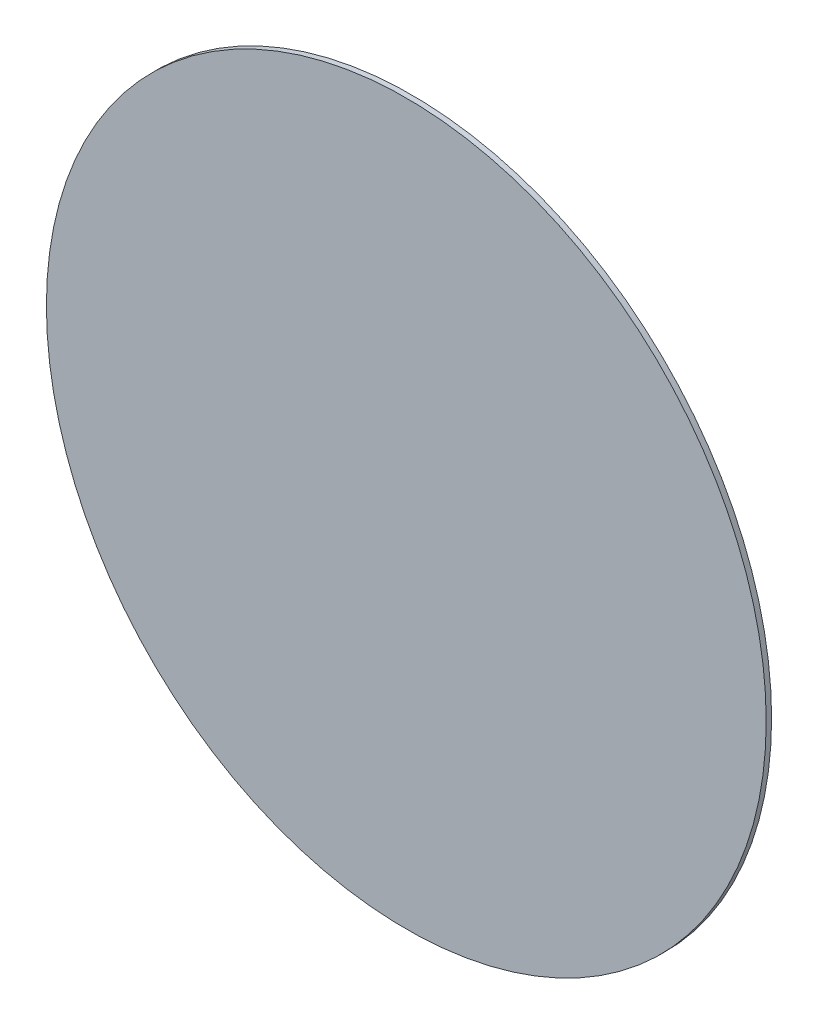
ISO-10303-21;
HEADER;
FILE_DESCRIPTION(('STEP AP214'),'2;1');
FILE_NAME('part.step','',(''),(''),'','','');
FILE_SCHEMA(('AUTOMOTIVE_DESIGN { 1 0 10303 214 1 1 1 1 }'));
ENDSEC;
DATA;
#1=APPLICATION_CONTEXT('core data for automotive mechanical design processes');
#2=APPLICATION_PROTOCOL_DEFINITION('international standard','automotive_design',2000,#1);
#3=PRODUCT_CONTEXT('',#1,'mechanical');
#4=PRODUCT('Part','Part','',(#3));
#5=PRODUCT_RELATED_PRODUCT_CATEGORY('part','',(#4));
#6=PRODUCT_DEFINITION_FORMATION('','',#4);
#7=PRODUCT_DEFINITION_CONTEXT('part definition',#1,'design');
#8=PRODUCT_DEFINITION('design','',#6,#7);
#9=PRODUCT_DEFINITION_SHAPE('','',#8);
#10=(LENGTH_UNIT() NAMED_UNIT(*) SI_UNIT(.MILLI.,.METRE.));
#11=(NAMED_UNIT(*) PLANE_ANGLE_UNIT() SI_UNIT($,.RADIAN.));
#12=(NAMED_UNIT(*) SI_UNIT($,.STERADIAN.) SOLID_ANGLE_UNIT());
#13=UNCERTAINTY_MEASURE_WITH_UNIT(LENGTH_MEASURE(1.E-05),#10,'distance_accuracy_value','');
#14=(GEOMETRIC_REPRESENTATION_CONTEXT(3) GLOBAL_UNCERTAINTY_ASSIGNED_CONTEXT((#13)) GLOBAL_UNIT_ASSIGNED_CONTEXT((#10,
#11,#12)) REPRESENTATION_CONTEXT('',''));
#15=CARTESIAN_POINT('',(0.,0.,0.));
#16=DIRECTION('',(0.,0.,1.));
#17=DIRECTION('',(1.,0.,0.));
#18=AXIS2_PLACEMENT_3D('',#15,#16,#17);
#19=CARTESIAN_POINT('',(0.555952951816014,2.694047048184,0.));
#20=DIRECTION('',(0.,0.,1.));
#21=DIRECTION('',(1.,0.,0.));
#22=AXIS2_PLACEMENT_3D('',#19,#20,#21);
#23=CYLINDRICAL_SURFACE('',#22,0.2);
#24=CARTESIAN_POINT('',(0.555952951816014,2.694047048184,0.003));
#25=DIRECTION('',(0.,0.,1.));
#26=DIRECTION('',(1.,0.,0.));
#27=AXIS2_PLACEMENT_3D('',#24,#25,#26);
#28=CIRCLE('',#27,0.2);
#29=CARTESIAN_POINT('',(0.755952951816014,2.694047048184,0.003));
#30=VERTEX_POINT('',#29);
#31=CARTESIAN_POINT('',(0.355952951816014,2.694047048184,0.003));
#32=VERTEX_POINT('',#31);
#33=EDGE_CURVE('E11',#30,#32,#28,.T.);
#34=ORIENTED_EDGE('',*,*,#33,.F.);
#35=CARTESIAN_POINT('',(0.555952951816014,2.694047048184,0.003));
#36=DIRECTION('',(0.,0.,1.));
#37=DIRECTION('',(1.,0.,0.));
#38=AXIS2_PLACEMENT_3D('',#35,#36,#37);
#39=CIRCLE('',#38,0.2);
#40=EDGE_CURVE('E24',#32,#30,#39,.T.);
#41=ORIENTED_EDGE('',*,*,#40,.F.);
#42=DIRECTION('',(0.,0.,-1.));
#43=VECTOR('',#42,1.);
#44=CARTESIAN_POINT('',(0.355952951816014,2.694047048184,0.));
#45=LINE('',#44,#43);
#46=CARTESIAN_POINT('',(0.355952951816014,2.694047048184,0.));
#47=VERTEX_POINT('',#46);
#48=EDGE_CURVE('E43',#32,#47,#45,.T.);
#49=ORIENTED_EDGE('',*,*,#48,.T.);
#50=CARTESIAN_POINT('',(0.555952951816014,2.694047048184,0.));
#51=DIRECTION('',(0.,0.,1.));
#52=DIRECTION('',(1.,0.,0.));
#53=AXIS2_PLACEMENT_3D('',#50,#51,#52);
#54=CIRCLE('',#53,0.2);
#55=CARTESIAN_POINT('',(0.755952951816014,2.694047048184,0.));
#56=VERTEX_POINT('',#55);
#57=EDGE_CURVE('E40',#47,#56,#54,.T.);
#58=ORIENTED_EDGE('',*,*,#57,.T.);
#59=CARTESIAN_POINT('',(0.555952951816014,2.694047048184,0.));
#60=DIRECTION('',(0.,0.,1.));
#61=DIRECTION('',(1.,0.,0.));
#62=AXIS2_PLACEMENT_3D('',#59,#60,#61);
#63=CIRCLE('',#62,0.2);
#64=EDGE_CURVE('E42',#56,#47,#63,.T.);
#65=ORIENTED_EDGE('',*,*,#64,.T.);
#66=ORIENTED_EDGE('',*,*,#48,.F.);
#67=EDGE_LOOP('',(#34,#41,#49,#58,#65,#66));
#68=FACE_BOUND('',#67,.T.);
#69=ADVANCED_FACE('F17',(#68),#23,.T.);
#70=CARTESIAN_POINT('',(0.555952951816014,2.694047048184,0.003));
#71=DIRECTION('',(0.,0.,1.));
#72=DIRECTION('',(1.,0.,0.));
#73=AXIS2_PLACEMENT_3D('',#70,#71,#72);
#74=PLANE('',#73);
#75=ORIENTED_EDGE('',*,*,#33,.T.);
#76=ORIENTED_EDGE('',*,*,#40,.T.);
#77=EDGE_LOOP('',(#75,#76));
#78=FACE_BOUND('',#77,.T.);
#79=ADVANCED_FACE('F49',(#78),#74,.T.);
#80=CARTESIAN_POINT('',(0.555952951816014,2.694047048184,0.));
#81=DIRECTION('',(0.,0.,1.));
#82=DIRECTION('',(1.,0.,0.));
#83=AXIS2_PLACEMENT_3D('',#80,#81,#82);
#84=PLANE('',#83);
#85=ORIENTED_EDGE('',*,*,#64,.F.);
#86=ORIENTED_EDGE('',*,*,#57,.F.);
#87=EDGE_LOOP('',(#85,#86));
#88=FACE_BOUND('',#87,.T.);
#89=ADVANCED_FACE('F46',(#88),#84,.F.);
#90=CLOSED_SHELL('',(#69,#79,#89));
#91=MANIFOLD_SOLID_BREP('B1',#90);
#92=ADVANCED_BREP_SHAPE_REPRESENTATION('',(#18,#91),#14);
#93=SHAPE_DEFINITION_REPRESENTATION(#9,#92);
ENDSEC;
END-ISO-10303-21;
